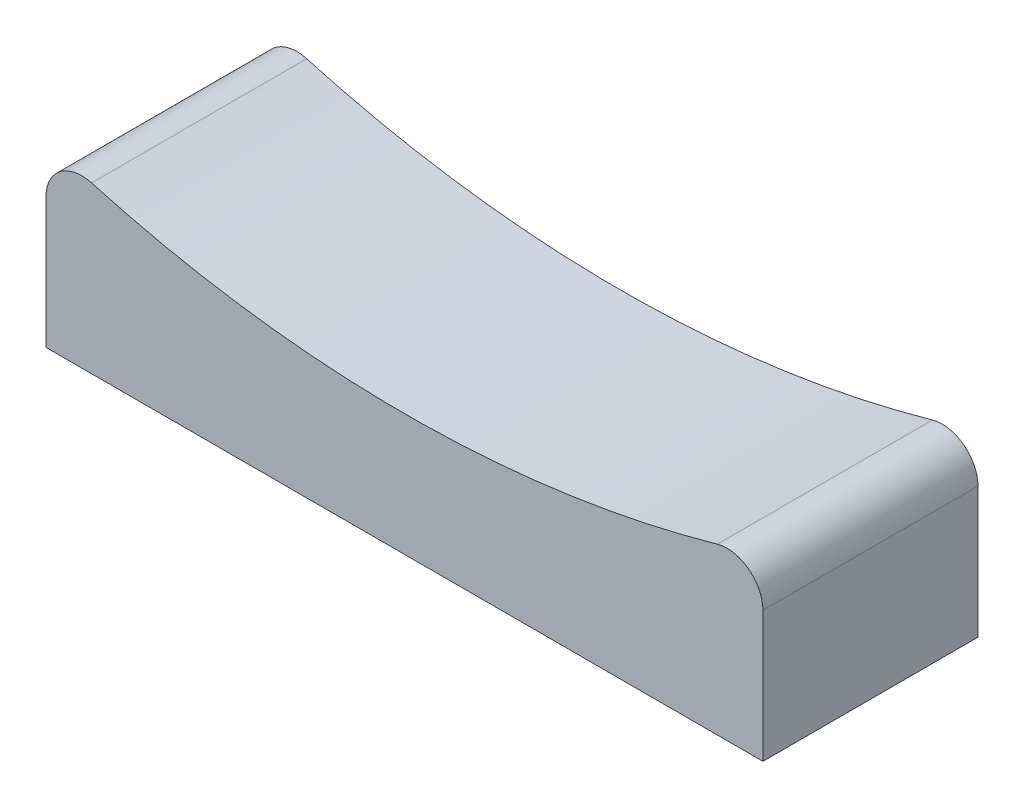
ISO-10303-21;
HEADER;
FILE_DESCRIPTION(('STEP AP214'),'2;1');
FILE_NAME('part.step','',(''),(''),'','','');
FILE_SCHEMA(('AUTOMOTIVE_DESIGN { 1 0 10303 214 1 1 1 1 }'));
ENDSEC;
DATA;
#1=APPLICATION_CONTEXT('core data for automotive mechanical design processes');
#2=APPLICATION_PROTOCOL_DEFINITION('international standard','automotive_design',2000,#1);
#3=PRODUCT_CONTEXT('',#1,'mechanical');
#4=PRODUCT('Part','Part','',(#3));
#5=PRODUCT_RELATED_PRODUCT_CATEGORY('part','',(#4));
#6=PRODUCT_DEFINITION_FORMATION('','',#4);
#7=PRODUCT_DEFINITION_CONTEXT('part definition',#1,'design');
#8=PRODUCT_DEFINITION('design','',#6,#7);
#9=PRODUCT_DEFINITION_SHAPE('','',#8);
#10=(LENGTH_UNIT() NAMED_UNIT(*) SI_UNIT(.MILLI.,.METRE.));
#11=(NAMED_UNIT(*) PLANE_ANGLE_UNIT() SI_UNIT($,.RADIAN.));
#12=(NAMED_UNIT(*) SI_UNIT($,.STERADIAN.) SOLID_ANGLE_UNIT());
#13=UNCERTAINTY_MEASURE_WITH_UNIT(LENGTH_MEASURE(1.E-05),#10,'distance_accuracy_value','');
#14=(GEOMETRIC_REPRESENTATION_CONTEXT(3) GLOBAL_UNCERTAINTY_ASSIGNED_CONTEXT((#13)) GLOBAL_UNIT_ASSIGNED_CONTEXT((#10,
#11,#12)) REPRESENTATION_CONTEXT('',''));
#15=CARTESIAN_POINT('',(0.,0.,0.));
#16=DIRECTION('',(0.,0.,1.));
#17=DIRECTION('',(1.,0.,0.));
#18=AXIS2_PLACEMENT_3D('',#15,#16,#17);
#19=CARTESIAN_POINT('',(50.,20.,-15.));
#20=DIRECTION('',(-1.,0.,0.));
#21=DIRECTION('',(0.,0.,1.));
#22=AXIS2_PLACEMENT_3D('',#19,#20,#21);
#23=PLANE('',#22);
#24=DIRECTION('',(0.,-1.,0.));
#25=VECTOR('',#24,1.);
#26=CARTESIAN_POINT('',(50.,20.,-15.));
#27=LINE('',#26,#25);
#28=CARTESIAN_POINT('',(50.,13.2450865539055,-15.));
#29=VERTEX_POINT('',#28);
#30=CARTESIAN_POINT('',(50.,-5.,-15.));
#31=VERTEX_POINT('',#30);
#32=EDGE_CURVE('E105',#29,#31,#27,.T.);
#33=ORIENTED_EDGE('',*,*,#32,.F.);
#34=DIRECTION('',(0.,0.,1.));
#35=VECTOR('',#34,1.);
#36=CARTESIAN_POINT('',(50.,13.2450865539055,-15.));
#37=LINE('',#36,#35);
#38=CARTESIAN_POINT('',(50.,13.2450865539055,15.));
#39=VERTEX_POINT('',#38);
#40=EDGE_CURVE('E65',#29,#39,#37,.T.);
#41=ORIENTED_EDGE('',*,*,#40,.T.);
#42=DIRECTION('',(0.,-1.,0.));
#43=VECTOR('',#42,1.);
#44=CARTESIAN_POINT('',(50.,20.,15.));
#45=LINE('',#44,#43);
#46=CARTESIAN_POINT('',(50.,-5.,15.));
#47=VERTEX_POINT('',#46);
#48=EDGE_CURVE('E131',#39,#47,#45,.T.);
#49=ORIENTED_EDGE('',*,*,#48,.T.);
#50=DIRECTION('',(0.,0.,1.));
#51=VECTOR('',#50,1.);
#52=CARTESIAN_POINT('',(50.,-5.,15.));
#53=LINE('',#52,#51);
#54=EDGE_CURVE('E115',#31,#47,#53,.T.);
#55=ORIENTED_EDGE('',*,*,#54,.F.);
#56=EDGE_LOOP('',(#33,#41,#49,#55));
#57=FACE_BOUND('',#56,.T.);
#58=ADVANCED_FACE('F41',(#57),#23,.F.);
#59=CARTESIAN_POINT('',(-50.,20.,-15.));
#60=DIRECTION('',(0.,0.,1.));
#61=DIRECTION('',(1.,0.,0.));
#62=AXIS2_PLACEMENT_3D('',#59,#60,#61);
#63=PLANE('',#62);
#64=CARTESIAN_POINT('',(0.,172.25,-15.));
#65=DIRECTION('',(0.,0.,1.));
#66=DIRECTION('',(1.,0.,0.));
#67=AXIS2_PLACEMENT_3D('',#64,#65,#66);
#68=CIRCLE('',#67,160.25);
#69=CARTESIAN_POINT('',(-43.6384266263238,18.0561278079477,-15.));
#70=VERTEX_POINT('',#69);
#71=CARTESIAN_POINT('',(43.6384266263237,18.0561278079477,-15.));
#72=VERTEX_POINT('',#71);
#73=EDGE_CURVE('E129',#70,#72,#68,.T.);
#74=ORIENTED_EDGE('',*,*,#73,.T.);
#75=CARTESIAN_POINT('',(45.,13.2450865539055,-15.));
#76=DIRECTION('',(0.,0.,1.));
#77=DIRECTION('',(1.,0.,0.));
#78=AXIS2_PLACEMENT_3D('',#75,#76,#77);
#79=CIRCLE('',#78,5.);
#80=EDGE_CURVE('E145',#72,#29,#79,.F.);
#81=ORIENTED_EDGE('',*,*,#80,.T.);
#82=ORIENTED_EDGE('',*,*,#32,.T.);
#83=DIRECTION('',(1.,0.,0.));
#84=VECTOR('',#83,1.);
#85=CARTESIAN_POINT('',(-50.,-5.,-15.));
#86=LINE('',#85,#84);
#87=CARTESIAN_POINT('',(-50.,-5.,-15.));
#88=VERTEX_POINT('',#87);
#89=EDGE_CURVE('E109',#88,#31,#86,.T.);
#90=ORIENTED_EDGE('',*,*,#89,.F.);
#91=DIRECTION('',(0.,-1.,0.));
#92=VECTOR('',#91,1.);
#93=CARTESIAN_POINT('',(-50.,20.,-15.));
#94=LINE('',#93,#92);
#95=CARTESIAN_POINT('',(-50.,13.2450865539055,-15.));
#96=VERTEX_POINT('',#95);
#97=EDGE_CURVE('E96',#96,#88,#94,.T.);
#98=ORIENTED_EDGE('',*,*,#97,.F.);
#99=CARTESIAN_POINT('',(-45.,13.2450865539055,-15.));
#100=DIRECTION('',(0.,0.,1.));
#101=DIRECTION('',(1.,0.,0.));
#102=AXIS2_PLACEMENT_3D('',#99,#100,#101);
#103=CIRCLE('',#102,5.);
#104=EDGE_CURVE('E143',#96,#70,#103,.F.);
#105=ORIENTED_EDGE('',*,*,#104,.T.);
#106=EDGE_LOOP('',(#74,#81,#82,#90,#98,#105));
#107=FACE_BOUND('',#106,.T.);
#108=ADVANCED_FACE('F111',(#107),#63,.F.);
#109=CARTESIAN_POINT('',(-50.,20.,-15.));
#110=DIRECTION('',(1.,0.,0.));
#111=DIRECTION('',(0.,0.,-1.));
#112=AXIS2_PLACEMENT_3D('',#109,#110,#111);
#113=PLANE('',#112);
#114=DIRECTION('',(0.,-1.,0.));
#115=VECTOR('',#114,1.);
#116=CARTESIAN_POINT('',(-50.,20.,15.));
#117=LINE('',#116,#115);
#118=CARTESIAN_POINT('',(-50.,13.2450865539055,15.));
#119=VERTEX_POINT('',#118);
#120=CARTESIAN_POINT('',(-50.,-5.,15.));
#121=VERTEX_POINT('',#120);
#122=EDGE_CURVE('E106',#119,#121,#117,.T.);
#123=ORIENTED_EDGE('',*,*,#122,.F.);
#124=DIRECTION('',(0.,0.,1.));
#125=VECTOR('',#124,1.);
#126=CARTESIAN_POINT('',(-50.,13.2450865539055,-15.));
#127=LINE('',#126,#125);
#128=EDGE_CURVE('E102',#119,#96,#127,.F.);
#129=ORIENTED_EDGE('',*,*,#128,.T.);
#130=ORIENTED_EDGE('',*,*,#97,.T.);
#131=DIRECTION('',(0.,0.,-1.));
#132=VECTOR('',#131,1.);
#133=CARTESIAN_POINT('',(-50.,-5.,15.));
#134=LINE('',#133,#132);
#135=EDGE_CURVE('E100',#121,#88,#134,.T.);
#136=ORIENTED_EDGE('',*,*,#135,.F.);
#137=EDGE_LOOP('',(#123,#129,#130,#136));
#138=FACE_BOUND('',#137,.T.);
#139=ADVANCED_FACE('F98',(#138),#113,.F.);
#140=CARTESIAN_POINT('',(-50.,20.,15.));
#141=DIRECTION('',(0.,0.,-1.));
#142=DIRECTION('',(-1.,0.,0.));
#143=AXIS2_PLACEMENT_3D('',#140,#141,#142);
#144=PLANE('',#143);
#145=ORIENTED_EDGE('',*,*,#48,.F.);
#146=CARTESIAN_POINT('',(45.,13.2450865539055,15.));
#147=DIRECTION('',(0.,0.,-1.));
#148=DIRECTION('',(-1.,0.,0.));
#149=AXIS2_PLACEMENT_3D('',#146,#147,#148);
#150=CIRCLE('',#149,5.);
#151=CARTESIAN_POINT('',(43.6384266263237,18.0561278079477,15.));
#152=VERTEX_POINT('',#151);
#153=EDGE_CURVE('E149',#39,#152,#150,.F.);
#154=ORIENTED_EDGE('',*,*,#153,.T.);
#155=CARTESIAN_POINT('',(0.,172.25,15.));
#156=DIRECTION('',(0.,0.,1.));
#157=DIRECTION('',(1.,0.,0.));
#158=AXIS2_PLACEMENT_3D('',#155,#156,#157);
#159=CIRCLE('',#158,160.25);
#160=CARTESIAN_POINT('',(-43.6384266263238,18.0561278079477,15.));
#161=VERTEX_POINT('',#160);
#162=EDGE_CURVE('E128',#161,#152,#159,.T.);
#163=ORIENTED_EDGE('',*,*,#162,.F.);
#164=CARTESIAN_POINT('',(-45.,13.2450865539055,15.));
#165=DIRECTION('',(0.,0.,-1.));
#166=DIRECTION('',(-1.,0.,0.));
#167=AXIS2_PLACEMENT_3D('',#164,#165,#166);
#168=CIRCLE('',#167,5.);
#169=EDGE_CURVE('E57',#161,#119,#168,.F.);
#170=ORIENTED_EDGE('',*,*,#169,.T.);
#171=ORIENTED_EDGE('',*,*,#122,.T.);
#172=DIRECTION('',(-1.,0.,0.));
#173=VECTOR('',#172,1.);
#174=CARTESIAN_POINT('',(-50.,-5.,15.));
#175=LINE('',#174,#173);
#176=EDGE_CURVE('E120',#47,#121,#175,.T.);
#177=ORIENTED_EDGE('',*,*,#176,.F.);
#178=EDGE_LOOP('',(#145,#154,#163,#170,#171,#177));
#179=FACE_BOUND('',#178,.T.);
#180=ADVANCED_FACE('F192',(#179),#144,.F.);
#181=CARTESIAN_POINT('',(0.,172.25,-15.));
#182=DIRECTION('',(0.,0.,1.));
#183=DIRECTION('',(1.,0.,0.));
#184=AXIS2_PLACEMENT_3D('',#181,#182,#183);
#185=CYLINDRICAL_SURFACE('',#184,160.25);
#186=ORIENTED_EDGE('',*,*,#162,.T.);
#187=DIRECTION('',(0.,0.,1.));
#188=VECTOR('',#187,1.);
#189=CARTESIAN_POINT('',(43.6384266263237,18.0561278079477,-15.));
#190=LINE('',#189,#188);
#191=EDGE_CURVE('E140',#152,#72,#190,.F.);
#192=ORIENTED_EDGE('',*,*,#191,.T.);
#193=ORIENTED_EDGE('',*,*,#73,.F.);
#194=DIRECTION('',(0.,0.,1.));
#195=VECTOR('',#194,1.);
#196=CARTESIAN_POINT('',(-43.6384266263238,18.0561278079477,-15.));
#197=LINE('',#196,#195);
#198=EDGE_CURVE('E137',#70,#161,#197,.T.);
#199=ORIENTED_EDGE('',*,*,#198,.T.);
#200=EDGE_LOOP('',(#186,#192,#193,#199));
#201=FACE_BOUND('',#200,.T.);
#202=ADVANCED_FACE('F179',(#201),#185,.F.);
#203=CARTESIAN_POINT('',(45.,13.2450865539055,-15.));
#204=DIRECTION('',(0.,0.,1.));
#205=DIRECTION('',(1.,0.,0.));
#206=AXIS2_PLACEMENT_3D('',#203,#204,#205);
#207=CYLINDRICAL_SURFACE('',#206,5.);
#208=ORIENTED_EDGE('',*,*,#153,.F.);
#209=ORIENTED_EDGE('',*,*,#40,.F.);
#210=ORIENTED_EDGE('',*,*,#80,.F.);
#211=ORIENTED_EDGE('',*,*,#191,.F.);
#212=EDGE_LOOP('',(#208,#209,#210,#211));
#213=FACE_BOUND('',#212,.T.);
#214=ADVANCED_FACE('F176',(#213),#207,.T.);
#215=CARTESIAN_POINT('',(-45.,13.2450865539055,-15.));
#216=DIRECTION('',(0.,0.,1.));
#217=DIRECTION('',(1.,0.,0.));
#218=AXIS2_PLACEMENT_3D('',#215,#216,#217);
#219=CYLINDRICAL_SURFACE('',#218,5.);
#220=ORIENTED_EDGE('',*,*,#104,.F.);
#221=ORIENTED_EDGE('',*,*,#128,.F.);
#222=ORIENTED_EDGE('',*,*,#169,.F.);
#223=ORIENTED_EDGE('',*,*,#198,.F.);
#224=EDGE_LOOP('',(#220,#221,#222,#223));
#225=FACE_BOUND('',#224,.T.);
#226=ADVANCED_FACE('F178',(#225),#219,.T.);
#227=CARTESIAN_POINT('',(0.,-5.,0.));
#228=DIRECTION('',(0.,-1.,0.));
#229=DIRECTION('',(0.,0.,-1.));
#230=AXIS2_PLACEMENT_3D('',#227,#228,#229);
#231=PLANE('',#230);
#232=CARTESIAN_POINT('',(0.,-5.,0.));
#233=DIRECTION('',(0.,-1.,0.));
#234=DIRECTION('',(0.,0.,-1.));
#235=AXIS2_PLACEMENT_3D('',#232,#233,#234);
#236=CIRCLE('',#235,8.67500000000002);
#237=CARTESIAN_POINT('',(0.,-5.,-8.67500000000002));
#238=VERTEX_POINT('',#237);
#239=EDGE_CURVE('E11',#238,#238,#236,.F.);
#240=ORIENTED_EDGE('',*,*,#239,.T.);
#241=EDGE_LOOP('',(#240));
#242=FACE_BOUND('',#241,.T.);
#243=ORIENTED_EDGE('',*,*,#135,.T.);
#244=ORIENTED_EDGE('',*,*,#89,.T.);
#245=ORIENTED_EDGE('',*,*,#54,.T.);
#246=ORIENTED_EDGE('',*,*,#176,.T.);
#247=EDGE_LOOP('',(#243,#244,#245,#246));
#248=FACE_BOUND('',#247,.T.);
#249=ADVANCED_FACE('F118',(#242,#248),#231,.T.);
#250=CARTESIAN_POINT('',(0.,0.,0.));
#251=DIRECTION('',(0.,-1.,0.));
#252=DIRECTION('',(0.,0.,-1.));
#253=AXIS2_PLACEMENT_3D('',#250,#251,#252);
#254=CYLINDRICAL_SURFACE('',#253,7.675);
#255=CARTESIAN_POINT('',(0.,-3.99999999999998,0.));
#256=DIRECTION('',(0.,-1.,0.));
#257=DIRECTION('',(0.,0.,-1.));
#258=AXIS2_PLACEMENT_3D('',#255,#256,#257);
#259=CIRCLE('',#258,7.675);
#260=CARTESIAN_POINT('',(0.,-3.99999999999998,-7.675));
#261=VERTEX_POINT('',#260);
#262=EDGE_CURVE('E50',#261,#261,#259,.T.);
#263=ORIENTED_EDGE('',*,*,#262,.T.);
#264=EDGE_LOOP('',(#263));
#265=FACE_BOUND('',#264,.T.);
#266=CARTESIAN_POINT('',(0.,0.,0.));
#267=DIRECTION('',(0.,-1.,0.));
#268=DIRECTION('',(0.,0.,-1.));
#269=AXIS2_PLACEMENT_3D('',#266,#267,#268);
#270=CIRCLE('',#269,7.675);
#271=CARTESIAN_POINT('',(0.,0.,-7.675));
#272=VERTEX_POINT('',#271);
#273=EDGE_CURVE('E121',#272,#272,#270,.T.);
#274=ORIENTED_EDGE('',*,*,#273,.F.);
#275=EDGE_LOOP('',(#274));
#276=FACE_BOUND('',#275,.T.);
#277=ADVANCED_FACE('F154',(#265,#276),#254,.F.);
#278=CARTESIAN_POINT('',(0.,0.,0.));
#279=DIRECTION('',(0.,-1.,0.));
#280=DIRECTION('',(0.,0.,-1.));
#281=AXIS2_PLACEMENT_3D('',#278,#279,#280);
#282=PLANE('',#281);
#283=ORIENTED_EDGE('',*,*,#273,.T.);
#284=EDGE_LOOP('',(#283));
#285=FACE_BOUND('',#284,.T.);
#286=ADVANCED_FACE('F158',(#285),#282,.T.);
#287=CARTESIAN_POINT('',(0.,-3.99999999999998,0.));
#288=DIRECTION('',(0.,-1.,0.));
#289=DIRECTION('',(0.,0.,-1.));
#290=AXIS2_PLACEMENT_3D('',#287,#288,#289);
#291=CONICAL_SURFACE('',#290,7.675,0.785398163397449);
#292=ORIENTED_EDGE('',*,*,#239,.F.);
#293=EDGE_LOOP('',(#292));
#294=FACE_BOUND('',#293,.T.);
#295=ORIENTED_EDGE('',*,*,#262,.F.);
#296=EDGE_LOOP('',(#295));
#297=FACE_BOUND('',#296,.T.);
#298=ADVANCED_FACE('F44',(#294,#297),#291,.F.);
#299=CLOSED_SHELL('',(#58,#108,#139,#180,#202,#214,#226,#249,#277,#286,#298));
#300=MANIFOLD_SOLID_BREP('B2',#299);
#301=ADVANCED_BREP_SHAPE_REPRESENTATION('',(#18,#300),#14);
#302=SHAPE_DEFINITION_REPRESENTATION(#9,#301);
ENDSEC;
END-ISO-10303-21;
